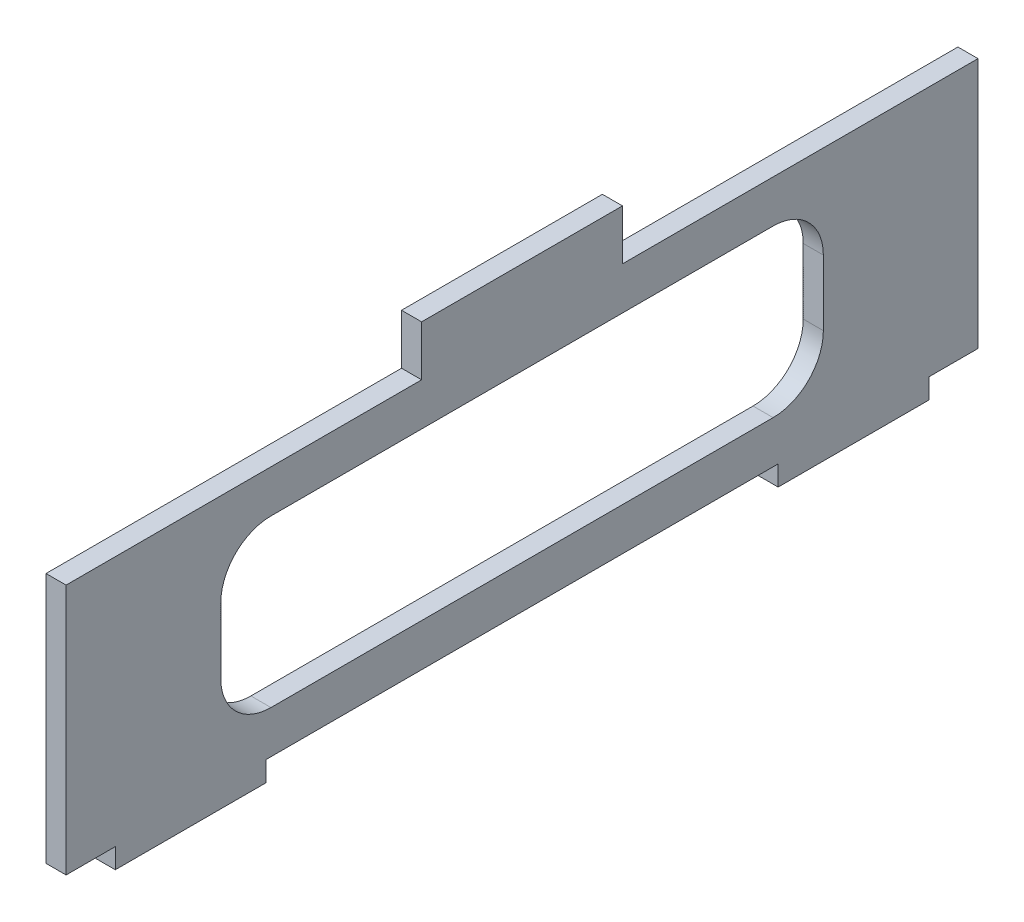
ISO-10303-21;
HEADER;
FILE_DESCRIPTION(('STEP AP214'),'2;1');
FILE_NAME('part.step','',(''),(''),'','','');
FILE_SCHEMA(('AUTOMOTIVE_DESIGN { 1 0 10303 214 1 1 1 1 }'));
ENDSEC;
DATA;
#1=APPLICATION_CONTEXT('core data for automotive mechanical design processes');
#2=APPLICATION_PROTOCOL_DEFINITION('international standard','automotive_design',2000,#1);
#3=PRODUCT_CONTEXT('',#1,'mechanical');
#4=PRODUCT('Part','Part','',(#3));
#5=PRODUCT_RELATED_PRODUCT_CATEGORY('part','',(#4));
#6=PRODUCT_DEFINITION_FORMATION('','',#4);
#7=PRODUCT_DEFINITION_CONTEXT('part definition',#1,'design');
#8=PRODUCT_DEFINITION('design','',#6,#7);
#9=PRODUCT_DEFINITION_SHAPE('','',#8);
#10=(LENGTH_UNIT() NAMED_UNIT(*) SI_UNIT(.MILLI.,.METRE.));
#11=(NAMED_UNIT(*) PLANE_ANGLE_UNIT() SI_UNIT($,.RADIAN.));
#12=(NAMED_UNIT(*) SI_UNIT($,.STERADIAN.) SOLID_ANGLE_UNIT());
#13=UNCERTAINTY_MEASURE_WITH_UNIT(LENGTH_MEASURE(1.E-05),#10,'distance_accuracy_value','');
#14=(GEOMETRIC_REPRESENTATION_CONTEXT(3) GLOBAL_UNCERTAINTY_ASSIGNED_CONTEXT((#13)) GLOBAL_UNIT_ASSIGNED_CONTEXT((#10,
#11,#12)) REPRESENTATION_CONTEXT('',''));
#15=CARTESIAN_POINT('',(0.,0.,0.));
#16=DIRECTION('',(0.,0.,1.));
#17=DIRECTION('',(1.,0.,0.));
#18=AXIS2_PLACEMENT_3D('',#15,#16,#17);
#19=CARTESIAN_POINT('',(4.,0.,0.));
#20=DIRECTION('',(1.,0.,0.));
#21=DIRECTION('',(0.,0.,-1.));
#22=AXIS2_PLACEMENT_3D('',#19,#20,#21);
#23=PLANE('',#22);
#24=DIRECTION('',(0.,0.,1.));
#25=VECTOR('',#24,1.);
#26=CARTESIAN_POINT('',(4.,25.,-20.));
#27=LINE('',#26,#25);
#28=CARTESIAN_POINT('',(4.,25.,-90.8));
#29=VERTEX_POINT('',#28);
#30=CARTESIAN_POINT('',(4.,25.,-20.));
#31=VERTEX_POINT('',#30);
#32=EDGE_CURVE('E264',#29,#31,#27,.T.);
#33=ORIENTED_EDGE('',*,*,#32,.T.);
#34=DIRECTION('',(0.,1.,0.));
#35=VECTOR('',#34,1.);
#36=CARTESIAN_POINT('',(4.,35.,-20.));
#37=LINE('',#36,#35);
#38=CARTESIAN_POINT('',(4.,35.,-20.));
#39=VERTEX_POINT('',#38);
#40=EDGE_CURVE('E268',#31,#39,#37,.T.);
#41=ORIENTED_EDGE('',*,*,#40,.T.);
#42=DIRECTION('',(0.,0.,1.));
#43=VECTOR('',#42,1.);
#44=CARTESIAN_POINT('',(4.,35.,20.));
#45=LINE('',#44,#43);
#46=CARTESIAN_POINT('',(4.,35.,20.));
#47=VERTEX_POINT('',#46);
#48=EDGE_CURVE('E271',#39,#47,#45,.T.);
#49=ORIENTED_EDGE('',*,*,#48,.T.);
#50=DIRECTION('',(0.,-1.,0.));
#51=VECTOR('',#50,1.);
#52=CARTESIAN_POINT('',(4.,25.,20.));
#53=LINE('',#52,#51);
#54=CARTESIAN_POINT('',(4.,25.,20.));
#55=VERTEX_POINT('',#54);
#56=EDGE_CURVE('E272',#47,#55,#53,.T.);
#57=ORIENTED_EDGE('',*,*,#56,.T.);
#58=DIRECTION('',(0.,0.,1.));
#59=VECTOR('',#58,1.);
#60=CARTESIAN_POINT('',(4.,25.,90.8));
#61=LINE('',#60,#59);
#62=CARTESIAN_POINT('',(4.,25.,90.8));
#63=VERTEX_POINT('',#62);
#64=EDGE_CURVE('E274',#55,#63,#61,.T.);
#65=ORIENTED_EDGE('',*,*,#64,.T.);
#66=DIRECTION('',(0.,-1.,0.));
#67=VECTOR('',#66,1.);
#68=CARTESIAN_POINT('',(4.,-25.,90.8));
#69=LINE('',#68,#67);
#70=CARTESIAN_POINT('',(4.,-25.,90.8));
#71=VERTEX_POINT('',#70);
#72=EDGE_CURVE('E280',#63,#71,#69,.T.);
#73=ORIENTED_EDGE('',*,*,#72,.T.);
#74=DIRECTION('',(0.,0.,-1.));
#75=VECTOR('',#74,1.);
#76=CARTESIAN_POINT('',(4.,-25.,90.8));
#77=LINE('',#76,#75);
#78=CARTESIAN_POINT('',(4.,-25.,81.));
#79=VERTEX_POINT('',#78);
#80=EDGE_CURVE('E276',#71,#79,#77,.T.);
#81=ORIENTED_EDGE('',*,*,#80,.T.);
#82=DIRECTION('',(0.,-1.,0.));
#83=VECTOR('',#82,1.);
#84=CARTESIAN_POINT('',(4.,-25.,81.));
#85=LINE('',#84,#83);
#86=CARTESIAN_POINT('',(4.,-29.,81.));
#87=VERTEX_POINT('',#86);
#88=EDGE_CURVE('E284',#79,#87,#85,.T.);
#89=ORIENTED_EDGE('',*,*,#88,.T.);
#90=DIRECTION('',(0.,0.,-1.));
#91=VECTOR('',#90,1.);
#92=CARTESIAN_POINT('',(4.,-29.,81.));
#93=LINE('',#92,#91);
#94=CARTESIAN_POINT('',(4.,-29.,51.));
#95=VERTEX_POINT('',#94);
#96=EDGE_CURVE('E285',#87,#95,#93,.T.);
#97=ORIENTED_EDGE('',*,*,#96,.T.);
#98=DIRECTION('',(0.,1.,0.));
#99=VECTOR('',#98,1.);
#100=CARTESIAN_POINT('',(4.,-29.,51.));
#101=LINE('',#100,#99);
#102=CARTESIAN_POINT('',(4.,-25.,51.));
#103=VERTEX_POINT('',#102);
#104=EDGE_CURVE('E282',#95,#103,#101,.T.);
#105=ORIENTED_EDGE('',*,*,#104,.T.);
#106=DIRECTION('',(0.,0.,-1.));
#107=VECTOR('',#106,1.);
#108=CARTESIAN_POINT('',(4.,-25.,51.));
#109=LINE('',#108,#107);
#110=CARTESIAN_POINT('',(4.,-25.,-51.));
#111=VERTEX_POINT('',#110);
#112=EDGE_CURVE('E290',#103,#111,#109,.T.);
#113=ORIENTED_EDGE('',*,*,#112,.T.);
#114=DIRECTION('',(0.,-1.,0.));
#115=VECTOR('',#114,1.);
#116=CARTESIAN_POINT('',(4.,-25.,-51.));
#117=LINE('',#116,#115);
#118=CARTESIAN_POINT('',(4.,-29.,-51.));
#119=VERTEX_POINT('',#118);
#120=EDGE_CURVE('E289',#111,#119,#117,.T.);
#121=ORIENTED_EDGE('',*,*,#120,.T.);
#122=DIRECTION('',(0.,0.,-1.));
#123=VECTOR('',#122,1.);
#124=CARTESIAN_POINT('',(4.,-29.,-51.));
#125=LINE('',#124,#123);
#126=CARTESIAN_POINT('',(4.,-29.,-81.));
#127=VERTEX_POINT('',#126);
#128=EDGE_CURVE('E292',#119,#127,#125,.T.);
#129=ORIENTED_EDGE('',*,*,#128,.T.);
#130=DIRECTION('',(0.,1.,0.));
#131=VECTOR('',#130,1.);
#132=CARTESIAN_POINT('',(4.,-29.,-81.));
#133=LINE('',#132,#131);
#134=CARTESIAN_POINT('',(4.,-25.,-81.));
#135=VERTEX_POINT('',#134);
#136=EDGE_CURVE('E291',#127,#135,#133,.T.);
#137=ORIENTED_EDGE('',*,*,#136,.T.);
#138=DIRECTION('',(0.,0.,-1.));
#139=VECTOR('',#138,1.);
#140=CARTESIAN_POINT('',(4.,-25.,-81.));
#141=LINE('',#140,#139);
#142=CARTESIAN_POINT('',(4.,-25.,-90.8));
#143=VERTEX_POINT('',#142);
#144=EDGE_CURVE('E293',#135,#143,#141,.T.);
#145=ORIENTED_EDGE('',*,*,#144,.T.);
#146=DIRECTION('',(0.,1.,0.));
#147=VECTOR('',#146,1.);
#148=CARTESIAN_POINT('',(4.,-25.,-90.8));
#149=LINE('',#148,#147);
#150=EDGE_CURVE('E296',#143,#29,#149,.T.);
#151=ORIENTED_EDGE('',*,*,#150,.T.);
#152=EDGE_LOOP('',(#33,#41,#49,#57,#65,#73,#81,#89,#97,#105,#113,#121,#129,#137,#145,#151));
#153=FACE_BOUND('',#152,.T.);
#154=DIRECTION('',(0.,0.,1.));
#155=VECTOR('',#154,1.);
#156=CARTESIAN_POINT('',(4.,16.5198237885463,50.));
#157=LINE('',#156,#155);
#158=CARTESIAN_POINT('',(4.,16.5198237885463,-50.));
#159=VERTEX_POINT('',#158);
#160=CARTESIAN_POINT('',(4.,16.5198237885463,50.));
#161=VERTEX_POINT('',#160);
#162=EDGE_CURVE('E208',#159,#161,#157,.T.);
#163=ORIENTED_EDGE('',*,*,#162,.F.);
#164=CARTESIAN_POINT('',(4.,6.51982378854626,-50.));
#165=DIRECTION('',(1.,0.,0.));
#166=DIRECTION('',(0.,0.,1.));
#167=AXIS2_PLACEMENT_3D('',#164,#165,#166);
#168=CIRCLE('',#167,10.);
#169=CARTESIAN_POINT('',(4.,6.51982378854626,-60.));
#170=VERTEX_POINT('',#169);
#171=EDGE_CURVE('E199',#170,#159,#168,.T.);
#172=ORIENTED_EDGE('',*,*,#171,.F.);
#173=DIRECTION('',(0.,1.,0.));
#174=VECTOR('',#173,1.);
#175=CARTESIAN_POINT('',(4.,6.51982378854626,-60.));
#176=LINE('',#175,#174);
#177=CARTESIAN_POINT('',(4.,-6.51982378854626,-60.));
#178=VERTEX_POINT('',#177);
#179=EDGE_CURVE('E231',#178,#170,#176,.T.);
#180=ORIENTED_EDGE('',*,*,#179,.F.);
#181=CARTESIAN_POINT('',(4.,-6.51982378854626,-50.));
#182=DIRECTION('',(1.,0.,0.));
#183=DIRECTION('',(0.,0.,1.));
#184=AXIS2_PLACEMENT_3D('',#181,#182,#183);
#185=CIRCLE('',#184,10.);
#186=CARTESIAN_POINT('',(4.,-16.5198237885463,-50.));
#187=VERTEX_POINT('',#186);
#188=EDGE_CURVE('E233',#187,#178,#185,.T.);
#189=ORIENTED_EDGE('',*,*,#188,.F.);
#190=DIRECTION('',(0.,0.,-1.));
#191=VECTOR('',#190,1.);
#192=CARTESIAN_POINT('',(4.,-16.5198237885463,50.));
#193=LINE('',#192,#191);
#194=CARTESIAN_POINT('',(4.,-16.5198237885463,50.));
#195=VERTEX_POINT('',#194);
#196=EDGE_CURVE('E228',#195,#187,#193,.T.);
#197=ORIENTED_EDGE('',*,*,#196,.F.);
#198=CARTESIAN_POINT('',(4.,-6.51982378854626,50.));
#199=DIRECTION('',(1.,0.,0.));
#200=DIRECTION('',(0.,0.,-1.));
#201=AXIS2_PLACEMENT_3D('',#198,#199,#200);
#202=CIRCLE('',#201,10.);
#203=CARTESIAN_POINT('',(4.,-6.51982378854626,60.));
#204=VERTEX_POINT('',#203);
#205=EDGE_CURVE('E226',#204,#195,#202,.T.);
#206=ORIENTED_EDGE('',*,*,#205,.F.);
#207=DIRECTION('',(0.,-1.,0.));
#208=VECTOR('',#207,1.);
#209=CARTESIAN_POINT('',(4.,6.51982378854626,60.));
#210=LINE('',#209,#208);
#211=CARTESIAN_POINT('',(4.,6.51982378854626,60.));
#212=VERTEX_POINT('',#211);
#213=EDGE_CURVE('E224',#212,#204,#210,.T.);
#214=ORIENTED_EDGE('',*,*,#213,.F.);
#215=CARTESIAN_POINT('',(4.,6.51982378854626,50.));
#216=DIRECTION('',(1.,0.,0.));
#217=DIRECTION('',(0.,0.,-1.));
#218=AXIS2_PLACEMENT_3D('',#215,#216,#217);
#219=CIRCLE('',#218,10.);
#220=EDGE_CURVE('E222',#161,#212,#219,.T.);
#221=ORIENTED_EDGE('',*,*,#220,.F.);
#222=EDGE_LOOP('',(#163,#172,#180,#189,#197,#206,#214,#221));
#223=FACE_BOUND('',#222,.T.);
#224=ADVANCED_FACE('F39',(#153,#223),#23,.T.);
#225=CARTESIAN_POINT('',(0.,0.,0.));
#226=DIRECTION('',(1.,0.,0.));
#227=DIRECTION('',(0.,0.,-1.));
#228=AXIS2_PLACEMENT_3D('',#225,#226,#227);
#229=PLANE('',#228);
#230=DIRECTION('',(0.,0.,1.));
#231=VECTOR('',#230,1.);
#232=CARTESIAN_POINT('',(0.,25.,-20.));
#233=LINE('',#232,#231);
#234=CARTESIAN_POINT('',(0.,25.,-90.8));
#235=VERTEX_POINT('',#234);
#236=CARTESIAN_POINT('',(0.,25.,-20.));
#237=VERTEX_POINT('',#236);
#238=EDGE_CURVE('E216',#235,#237,#233,.T.);
#239=ORIENTED_EDGE('',*,*,#238,.F.);
#240=DIRECTION('',(0.,1.,0.));
#241=VECTOR('',#240,1.);
#242=CARTESIAN_POINT('',(0.,-25.,-90.8));
#243=LINE('',#242,#241);
#244=CARTESIAN_POINT('',(0.,-25.,-90.8));
#245=VERTEX_POINT('',#244);
#246=EDGE_CURVE('E267',#245,#235,#243,.T.);
#247=ORIENTED_EDGE('',*,*,#246,.F.);
#248=DIRECTION('',(0.,0.,-1.));
#249=VECTOR('',#248,1.);
#250=CARTESIAN_POINT('',(0.,-25.,-81.));
#251=LINE('',#250,#249);
#252=CARTESIAN_POINT('',(0.,-25.,-81.));
#253=VERTEX_POINT('',#252);
#254=EDGE_CURVE('E327',#253,#245,#251,.T.);
#255=ORIENTED_EDGE('',*,*,#254,.F.);
#256=DIRECTION('',(0.,1.,0.));
#257=VECTOR('',#256,1.);
#258=CARTESIAN_POINT('',(0.,-29.,-81.));
#259=LINE('',#258,#257);
#260=CARTESIAN_POINT('',(0.,-29.,-81.));
#261=VERTEX_POINT('',#260);
#262=EDGE_CURVE('E326',#261,#253,#259,.T.);
#263=ORIENTED_EDGE('',*,*,#262,.F.);
#264=DIRECTION('',(0.,0.,-1.));
#265=VECTOR('',#264,1.);
#266=CARTESIAN_POINT('',(0.,-29.,-51.));
#267=LINE('',#266,#265);
#268=CARTESIAN_POINT('',(0.,-29.,-51.));
#269=VERTEX_POINT('',#268);
#270=EDGE_CURVE('E322',#269,#261,#267,.T.);
#271=ORIENTED_EDGE('',*,*,#270,.F.);
#272=DIRECTION('',(0.,-1.,0.));
#273=VECTOR('',#272,1.);
#274=CARTESIAN_POINT('',(0.,-25.,-51.));
#275=LINE('',#274,#273);
#276=CARTESIAN_POINT('',(0.,-25.,-51.));
#277=VERTEX_POINT('',#276);
#278=EDGE_CURVE('E325',#277,#269,#275,.T.);
#279=ORIENTED_EDGE('',*,*,#278,.F.);
#280=DIRECTION('',(0.,0.,-1.));
#281=VECTOR('',#280,1.);
#282=CARTESIAN_POINT('',(0.,-25.,51.));
#283=LINE('',#282,#281);
#284=CARTESIAN_POINT('',(0.,-25.,51.));
#285=VERTEX_POINT('',#284);
#286=EDGE_CURVE('E319',#285,#277,#283,.T.);
#287=ORIENTED_EDGE('',*,*,#286,.F.);
#288=DIRECTION('',(0.,1.,0.));
#289=VECTOR('',#288,1.);
#290=CARTESIAN_POINT('',(0.,-29.,51.));
#291=LINE('',#290,#289);
#292=CARTESIAN_POINT('',(0.,-29.,51.));
#293=VERTEX_POINT('',#292);
#294=EDGE_CURVE('E318',#293,#285,#291,.T.);
#295=ORIENTED_EDGE('',*,*,#294,.F.);
#296=DIRECTION('',(0.,0.,-1.));
#297=VECTOR('',#296,1.);
#298=CARTESIAN_POINT('',(0.,-29.,81.));
#299=LINE('',#298,#297);
#300=CARTESIAN_POINT('',(0.,-29.,81.));
#301=VERTEX_POINT('',#300);
#302=EDGE_CURVE('E316',#301,#293,#299,.T.);
#303=ORIENTED_EDGE('',*,*,#302,.F.);
#304=DIRECTION('',(0.,-1.,0.));
#305=VECTOR('',#304,1.);
#306=CARTESIAN_POINT('',(0.,-25.,81.));
#307=LINE('',#306,#305);
#308=CARTESIAN_POINT('',(0.,-25.,81.));
#309=VERTEX_POINT('',#308);
#310=EDGE_CURVE('E314',#309,#301,#307,.T.);
#311=ORIENTED_EDGE('',*,*,#310,.F.);
#312=DIRECTION('',(0.,0.,-1.));
#313=VECTOR('',#312,1.);
#314=CARTESIAN_POINT('',(0.,-25.,90.8));
#315=LINE('',#314,#313);
#316=CARTESIAN_POINT('',(0.,-25.,90.8));
#317=VERTEX_POINT('',#316);
#318=EDGE_CURVE('E315',#317,#309,#315,.T.);
#319=ORIENTED_EDGE('',*,*,#318,.F.);
#320=DIRECTION('',(0.,-1.,0.));
#321=VECTOR('',#320,1.);
#322=CARTESIAN_POINT('',(0.,-25.,90.8));
#323=LINE('',#322,#321);
#324=CARTESIAN_POINT('',(0.,25.,90.8));
#325=VERTEX_POINT('',#324);
#326=EDGE_CURVE('E309',#325,#317,#323,.T.);
#327=ORIENTED_EDGE('',*,*,#326,.F.);
#328=DIRECTION('',(0.,0.,1.));
#329=VECTOR('',#328,1.);
#330=CARTESIAN_POINT('',(0.,25.,90.8));
#331=LINE('',#330,#329);
#332=CARTESIAN_POINT('',(0.,25.,20.));
#333=VERTEX_POINT('',#332);
#334=EDGE_CURVE('E306',#333,#325,#331,.T.);
#335=ORIENTED_EDGE('',*,*,#334,.F.);
#336=DIRECTION('',(0.,-1.,0.));
#337=VECTOR('',#336,1.);
#338=CARTESIAN_POINT('',(0.,25.,20.));
#339=LINE('',#338,#337);
#340=CARTESIAN_POINT('',(0.,35.,20.));
#341=VERTEX_POINT('',#340);
#342=EDGE_CURVE('E308',#341,#333,#339,.T.);
#343=ORIENTED_EDGE('',*,*,#342,.F.);
#344=DIRECTION('',(0.,0.,1.));
#345=VECTOR('',#344,1.);
#346=CARTESIAN_POINT('',(0.,35.,20.));
#347=LINE('',#346,#345);
#348=CARTESIAN_POINT('',(0.,35.,-20.));
#349=VERTEX_POINT('',#348);
#350=EDGE_CURVE('E304',#349,#341,#347,.T.);
#351=ORIENTED_EDGE('',*,*,#350,.F.);
#352=DIRECTION('',(0.,1.,0.));
#353=VECTOR('',#352,1.);
#354=CARTESIAN_POINT('',(0.,35.,-20.));
#355=LINE('',#354,#353);
#356=EDGE_CURVE('E305',#237,#349,#355,.T.);
#357=ORIENTED_EDGE('',*,*,#356,.F.);
#358=EDGE_LOOP('',(#239,#247,#255,#263,#271,#279,#287,#295,#303,#311,#319,#327,#335,#343,#351,#357));
#359=FACE_BOUND('',#358,.T.);
#360=CARTESIAN_POINT('',(0.,6.51982378854626,-50.));
#361=DIRECTION('',(1.,0.,0.));
#362=DIRECTION('',(0.,0.,1.));
#363=AXIS2_PLACEMENT_3D('',#360,#361,#362);
#364=CIRCLE('',#363,10.);
#365=CARTESIAN_POINT('',(0.,6.51982378854626,-60.));
#366=VERTEX_POINT('',#365);
#367=CARTESIAN_POINT('',(0.,16.5198237885463,-50.));
#368=VERTEX_POINT('',#367);
#369=EDGE_CURVE('E61',#366,#368,#364,.T.);
#370=ORIENTED_EDGE('',*,*,#369,.T.);
#371=DIRECTION('',(0.,0.,1.));
#372=VECTOR('',#371,1.);
#373=CARTESIAN_POINT('',(0.,16.5198237885463,50.));
#374=LINE('',#373,#372);
#375=CARTESIAN_POINT('',(0.,16.5198237885463,50.));
#376=VERTEX_POINT('',#375);
#377=EDGE_CURVE('E214',#368,#376,#374,.T.);
#378=ORIENTED_EDGE('',*,*,#377,.T.);
#379=CARTESIAN_POINT('',(0.,6.51982378854626,50.));
#380=DIRECTION('',(1.,0.,0.));
#381=DIRECTION('',(0.,0.,-1.));
#382=AXIS2_PLACEMENT_3D('',#379,#380,#381);
#383=CIRCLE('',#382,10.);
#384=CARTESIAN_POINT('',(0.,6.51982378854626,60.));
#385=VERTEX_POINT('',#384);
#386=EDGE_CURVE('E240',#376,#385,#383,.T.);
#387=ORIENTED_EDGE('',*,*,#386,.T.);
#388=DIRECTION('',(0.,-1.,0.));
#389=VECTOR('',#388,1.);
#390=CARTESIAN_POINT('',(0.,6.51982378854626,60.));
#391=LINE('',#390,#389);
#392=CARTESIAN_POINT('',(0.,-6.51982378854626,60.));
#393=VERTEX_POINT('',#392);
#394=EDGE_CURVE('E238',#385,#393,#391,.T.);
#395=ORIENTED_EDGE('',*,*,#394,.T.);
#396=CARTESIAN_POINT('',(0.,-6.51982378854626,50.));
#397=DIRECTION('',(1.,0.,0.));
#398=DIRECTION('',(0.,0.,-1.));
#399=AXIS2_PLACEMENT_3D('',#396,#397,#398);
#400=CIRCLE('',#399,10.);
#401=CARTESIAN_POINT('',(0.,-16.5198237885463,50.));
#402=VERTEX_POINT('',#401);
#403=EDGE_CURVE('E245',#393,#402,#400,.T.);
#404=ORIENTED_EDGE('',*,*,#403,.T.);
#405=DIRECTION('',(0.,0.,-1.));
#406=VECTOR('',#405,1.);
#407=CARTESIAN_POINT('',(0.,-16.5198237885463,50.));
#408=LINE('',#407,#406);
#409=CARTESIAN_POINT('',(0.,-16.5198237885463,-50.));
#410=VERTEX_POINT('',#409);
#411=EDGE_CURVE('E248',#402,#410,#408,.T.);
#412=ORIENTED_EDGE('',*,*,#411,.T.);
#413=CARTESIAN_POINT('',(0.,-6.51982378854626,-50.));
#414=DIRECTION('',(1.,0.,0.));
#415=DIRECTION('',(0.,0.,1.));
#416=AXIS2_PLACEMENT_3D('',#413,#414,#415);
#417=CIRCLE('',#416,10.);
#418=CARTESIAN_POINT('',(0.,-6.51982378854626,-60.));
#419=VERTEX_POINT('',#418);
#420=EDGE_CURVE('E249',#410,#419,#417,.T.);
#421=ORIENTED_EDGE('',*,*,#420,.T.);
#422=DIRECTION('',(0.,1.,0.));
#423=VECTOR('',#422,1.);
#424=CARTESIAN_POINT('',(0.,6.51982378854626,-60.));
#425=LINE('',#424,#423);
#426=EDGE_CURVE('E207',#419,#366,#425,.T.);
#427=ORIENTED_EDGE('',*,*,#426,.T.);
#428=EDGE_LOOP('',(#370,#378,#387,#395,#404,#412,#421,#427));
#429=FACE_BOUND('',#428,.T.);
#430=ADVANCED_FACE('F385',(#359,#429),#229,.F.);
#431=CARTESIAN_POINT('',(4.,25.,-20.));
#432=DIRECTION('',(0.,-1.,0.));
#433=DIRECTION('',(0.,0.,-1.));
#434=AXIS2_PLACEMENT_3D('',#431,#432,#433);
#435=PLANE('',#434);
#436=ORIENTED_EDGE('',*,*,#238,.T.);
#437=DIRECTION('',(-1.,0.,0.));
#438=VECTOR('',#437,1.);
#439=CARTESIAN_POINT('',(4.,25.,-20.));
#440=LINE('',#439,#438);
#441=EDGE_CURVE('E11',#31,#237,#440,.T.);
#442=ORIENTED_EDGE('',*,*,#441,.F.);
#443=ORIENTED_EDGE('',*,*,#32,.F.);
#444=DIRECTION('',(-1.,0.,0.));
#445=VECTOR('',#444,1.);
#446=CARTESIAN_POINT('',(4.,25.,-90.8));
#447=LINE('',#446,#445);
#448=EDGE_CURVE('E298',#29,#235,#447,.T.);
#449=ORIENTED_EDGE('',*,*,#448,.T.);
#450=EDGE_LOOP('',(#436,#442,#443,#449));
#451=FACE_BOUND('',#450,.T.);
#452=ADVANCED_FACE('F41',(#451),#435,.F.);
#453=CARTESIAN_POINT('',(4.,35.,-20.));
#454=DIRECTION('',(0.,0.,1.));
#455=DIRECTION('',(1.,0.,0.));
#456=AXIS2_PLACEMENT_3D('',#453,#454,#455);
#457=PLANE('',#456);
#458=ORIENTED_EDGE('',*,*,#356,.T.);
#459=DIRECTION('',(-1.,0.,0.));
#460=VECTOR('',#459,1.);
#461=CARTESIAN_POINT('',(4.,35.,-20.));
#462=LINE('',#461,#460);
#463=EDGE_CURVE('E50',#39,#349,#462,.T.);
#464=ORIENTED_EDGE('',*,*,#463,.F.);
#465=ORIENTED_EDGE('',*,*,#40,.F.);
#466=ORIENTED_EDGE('',*,*,#441,.T.);
#467=EDGE_LOOP('',(#458,#464,#465,#466));
#468=FACE_BOUND('',#467,.T.);
#469=ADVANCED_FACE('F399',(#468),#457,.F.);
#470=CARTESIAN_POINT('',(4.,35.,20.));
#471=DIRECTION('',(0.,-1.,0.));
#472=DIRECTION('',(0.,0.,-1.));
#473=AXIS2_PLACEMENT_3D('',#470,#471,#472);
#474=PLANE('',#473);
#475=ORIENTED_EDGE('',*,*,#350,.T.);
#476=DIRECTION('',(-1.,0.,0.));
#477=VECTOR('',#476,1.);
#478=CARTESIAN_POINT('',(4.,35.,20.));
#479=LINE('',#478,#477);
#480=EDGE_CURVE('E369',#47,#341,#479,.T.);
#481=ORIENTED_EDGE('',*,*,#480,.F.);
#482=ORIENTED_EDGE('',*,*,#48,.F.);
#483=ORIENTED_EDGE('',*,*,#463,.T.);
#484=EDGE_LOOP('',(#475,#481,#482,#483));
#485=FACE_BOUND('',#484,.T.);
#486=ADVANCED_FACE('F376',(#485),#474,.F.);
#487=CARTESIAN_POINT('',(4.,25.,20.));
#488=DIRECTION('',(0.,0.,-1.));
#489=DIRECTION('',(-1.,0.,0.));
#490=AXIS2_PLACEMENT_3D('',#487,#488,#489);
#491=PLANE('',#490);
#492=ORIENTED_EDGE('',*,*,#342,.T.);
#493=DIRECTION('',(-1.,0.,0.));
#494=VECTOR('',#493,1.);
#495=CARTESIAN_POINT('',(4.,25.,20.));
#496=LINE('',#495,#494);
#497=EDGE_CURVE('E368',#55,#333,#496,.T.);
#498=ORIENTED_EDGE('',*,*,#497,.F.);
#499=ORIENTED_EDGE('',*,*,#56,.F.);
#500=ORIENTED_EDGE('',*,*,#480,.T.);
#501=EDGE_LOOP('',(#492,#498,#499,#500));
#502=FACE_BOUND('',#501,.T.);
#503=ADVANCED_FACE('F389',(#502),#491,.F.);
#504=CARTESIAN_POINT('',(4.,25.,90.8));
#505=DIRECTION('',(0.,-1.,0.));
#506=DIRECTION('',(0.,0.,-1.));
#507=AXIS2_PLACEMENT_3D('',#504,#505,#506);
#508=PLANE('',#507);
#509=ORIENTED_EDGE('',*,*,#334,.T.);
#510=DIRECTION('',(-1.,0.,0.));
#511=VECTOR('',#510,1.);
#512=CARTESIAN_POINT('',(4.,25.,90.8));
#513=LINE('',#512,#511);
#514=EDGE_CURVE('E361',#63,#325,#513,.T.);
#515=ORIENTED_EDGE('',*,*,#514,.F.);
#516=ORIENTED_EDGE('',*,*,#64,.F.);
#517=ORIENTED_EDGE('',*,*,#497,.T.);
#518=EDGE_LOOP('',(#509,#515,#516,#517));
#519=FACE_BOUND('',#518,.T.);
#520=ADVANCED_FACE('F391',(#519),#508,.F.);
#521=CARTESIAN_POINT('',(4.,-25.,90.8));
#522=DIRECTION('',(0.,0.,-1.));
#523=DIRECTION('',(-1.,0.,0.));
#524=AXIS2_PLACEMENT_3D('',#521,#522,#523);
#525=PLANE('',#524);
#526=ORIENTED_EDGE('',*,*,#326,.T.);
#527=DIRECTION('',(-1.,0.,0.));
#528=VECTOR('',#527,1.);
#529=CARTESIAN_POINT('',(4.,-25.,90.8));
#530=LINE('',#529,#528);
#531=EDGE_CURVE('E357',#71,#317,#530,.T.);
#532=ORIENTED_EDGE('',*,*,#531,.F.);
#533=ORIENTED_EDGE('',*,*,#72,.F.);
#534=ORIENTED_EDGE('',*,*,#514,.T.);
#535=EDGE_LOOP('',(#526,#532,#533,#534));
#536=FACE_BOUND('',#535,.T.);
#537=ADVANCED_FACE('F455',(#536),#525,.F.);
#538=CARTESIAN_POINT('',(4.,-25.,90.8));
#539=DIRECTION('',(0.,1.,0.));
#540=DIRECTION('',(0.,0.,1.));
#541=AXIS2_PLACEMENT_3D('',#538,#539,#540);
#542=PLANE('',#541);
#543=ORIENTED_EDGE('',*,*,#318,.T.);
#544=DIRECTION('',(-1.,0.,0.));
#545=VECTOR('',#544,1.);
#546=CARTESIAN_POINT('',(4.,-25.,81.));
#547=LINE('',#546,#545);
#548=EDGE_CURVE('E360',#79,#309,#547,.T.);
#549=ORIENTED_EDGE('',*,*,#548,.F.);
#550=ORIENTED_EDGE('',*,*,#80,.F.);
#551=ORIENTED_EDGE('',*,*,#531,.T.);
#552=EDGE_LOOP('',(#543,#549,#550,#551));
#553=FACE_BOUND('',#552,.T.);
#554=ADVANCED_FACE('F448',(#553),#542,.F.);
#555=CARTESIAN_POINT('',(4.,-25.,81.));
#556=DIRECTION('',(0.,0.,-1.));
#557=DIRECTION('',(-1.,0.,0.));
#558=AXIS2_PLACEMENT_3D('',#555,#556,#557);
#559=PLANE('',#558);
#560=ORIENTED_EDGE('',*,*,#310,.T.);
#561=DIRECTION('',(-1.,0.,0.));
#562=VECTOR('',#561,1.);
#563=CARTESIAN_POINT('',(4.,-29.,81.));
#564=LINE('',#563,#562);
#565=EDGE_CURVE('E353',#87,#301,#564,.T.);
#566=ORIENTED_EDGE('',*,*,#565,.F.);
#567=ORIENTED_EDGE('',*,*,#88,.F.);
#568=ORIENTED_EDGE('',*,*,#548,.T.);
#569=EDGE_LOOP('',(#560,#566,#567,#568));
#570=FACE_BOUND('',#569,.T.);
#571=ADVANCED_FACE('F443',(#570),#559,.F.);
#572=CARTESIAN_POINT('',(4.,-29.,81.));
#573=DIRECTION('',(0.,1.,0.));
#574=DIRECTION('',(0.,0.,1.));
#575=AXIS2_PLACEMENT_3D('',#572,#573,#574);
#576=PLANE('',#575);
#577=ORIENTED_EDGE('',*,*,#302,.T.);
#578=DIRECTION('',(-1.,0.,0.));
#579=VECTOR('',#578,1.);
#580=CARTESIAN_POINT('',(4.,-29.,51.));
#581=LINE('',#580,#579);
#582=EDGE_CURVE('E354',#95,#293,#581,.T.);
#583=ORIENTED_EDGE('',*,*,#582,.F.);
#584=ORIENTED_EDGE('',*,*,#96,.F.);
#585=ORIENTED_EDGE('',*,*,#565,.T.);
#586=EDGE_LOOP('',(#577,#583,#584,#585));
#587=FACE_BOUND('',#586,.T.);
#588=ADVANCED_FACE('F442',(#587),#576,.F.);
#589=CARTESIAN_POINT('',(4.,-29.,51.));
#590=DIRECTION('',(0.,0.,1.));
#591=DIRECTION('',(1.,0.,0.));
#592=AXIS2_PLACEMENT_3D('',#589,#590,#591);
#593=PLANE('',#592);
#594=ORIENTED_EDGE('',*,*,#294,.T.);
#595=DIRECTION('',(-1.,0.,0.));
#596=VECTOR('',#595,1.);
#597=CARTESIAN_POINT('',(4.,-25.,51.));
#598=LINE('',#597,#596);
#599=EDGE_CURVE('E346',#103,#285,#598,.T.);
#600=ORIENTED_EDGE('',*,*,#599,.F.);
#601=ORIENTED_EDGE('',*,*,#104,.F.);
#602=ORIENTED_EDGE('',*,*,#582,.T.);
#603=EDGE_LOOP('',(#594,#600,#601,#602));
#604=FACE_BOUND('',#603,.T.);
#605=ADVANCED_FACE('F436',(#604),#593,.F.);
#606=CARTESIAN_POINT('',(4.,-25.,51.));
#607=DIRECTION('',(0.,1.,0.));
#608=DIRECTION('',(0.,0.,1.));
#609=AXIS2_PLACEMENT_3D('',#606,#607,#608);
#610=PLANE('',#609);
#611=ORIENTED_EDGE('',*,*,#286,.T.);
#612=DIRECTION('',(-1.,0.,0.));
#613=VECTOR('',#612,1.);
#614=CARTESIAN_POINT('',(4.,-25.,-51.));
#615=LINE('',#614,#613);
#616=EDGE_CURVE('E342',#111,#277,#615,.T.);
#617=ORIENTED_EDGE('',*,*,#616,.F.);
#618=ORIENTED_EDGE('',*,*,#112,.F.);
#619=ORIENTED_EDGE('',*,*,#599,.T.);
#620=EDGE_LOOP('',(#611,#617,#618,#619));
#621=FACE_BOUND('',#620,.T.);
#622=ADVANCED_FACE('F429',(#621),#610,.F.);
#623=CARTESIAN_POINT('',(4.,-25.,-51.));
#624=DIRECTION('',(0.,0.,-1.));
#625=DIRECTION('',(-1.,0.,0.));
#626=AXIS2_PLACEMENT_3D('',#623,#624,#625);
#627=PLANE('',#626);
#628=ORIENTED_EDGE('',*,*,#278,.T.);
#629=DIRECTION('',(-1.,0.,0.));
#630=VECTOR('',#629,1.);
#631=CARTESIAN_POINT('',(4.,-29.,-51.));
#632=LINE('',#631,#630);
#633=EDGE_CURVE('E345',#119,#269,#632,.T.);
#634=ORIENTED_EDGE('',*,*,#633,.F.);
#635=ORIENTED_EDGE('',*,*,#120,.F.);
#636=ORIENTED_EDGE('',*,*,#616,.T.);
#637=EDGE_LOOP('',(#628,#634,#635,#636));
#638=FACE_BOUND('',#637,.T.);
#639=ADVANCED_FACE('F426',(#638),#627,.F.);
#640=CARTESIAN_POINT('',(4.,-29.,-51.));
#641=DIRECTION('',(0.,1.,0.));
#642=DIRECTION('',(0.,0.,1.));
#643=AXIS2_PLACEMENT_3D('',#640,#641,#642);
#644=PLANE('',#643);
#645=ORIENTED_EDGE('',*,*,#270,.T.);
#646=DIRECTION('',(-1.,0.,0.));
#647=VECTOR('',#646,1.);
#648=CARTESIAN_POINT('',(4.,-29.,-81.));
#649=LINE('',#648,#647);
#650=EDGE_CURVE('E338',#127,#261,#649,.T.);
#651=ORIENTED_EDGE('',*,*,#650,.F.);
#652=ORIENTED_EDGE('',*,*,#128,.F.);
#653=ORIENTED_EDGE('',*,*,#633,.T.);
#654=EDGE_LOOP('',(#645,#651,#652,#653));
#655=FACE_BOUND('',#654,.T.);
#656=ADVANCED_FACE('F423',(#655),#644,.F.);
#657=CARTESIAN_POINT('',(4.,-29.,-81.));
#658=DIRECTION('',(0.,0.,1.));
#659=DIRECTION('',(1.,0.,0.));
#660=AXIS2_PLACEMENT_3D('',#657,#658,#659);
#661=PLANE('',#660);
#662=ORIENTED_EDGE('',*,*,#262,.T.);
#663=DIRECTION('',(-1.,0.,0.));
#664=VECTOR('',#663,1.);
#665=CARTESIAN_POINT('',(4.,-25.,-81.));
#666=LINE('',#665,#664);
#667=EDGE_CURVE('E339',#135,#253,#666,.T.);
#668=ORIENTED_EDGE('',*,*,#667,.F.);
#669=ORIENTED_EDGE('',*,*,#136,.F.);
#670=ORIENTED_EDGE('',*,*,#650,.T.);
#671=EDGE_LOOP('',(#662,#668,#669,#670));
#672=FACE_BOUND('',#671,.T.);
#673=ADVANCED_FACE('F412',(#672),#661,.F.);
#674=CARTESIAN_POINT('',(4.,-25.,-81.));
#675=DIRECTION('',(0.,1.,0.));
#676=DIRECTION('',(0.,0.,1.));
#677=AXIS2_PLACEMENT_3D('',#674,#675,#676);
#678=PLANE('',#677);
#679=ORIENTED_EDGE('',*,*,#254,.T.);
#680=DIRECTION('',(-1.,0.,0.));
#681=VECTOR('',#680,1.);
#682=CARTESIAN_POINT('',(4.,-25.,-90.8));
#683=LINE('',#682,#681);
#684=EDGE_CURVE('E334',#143,#245,#683,.T.);
#685=ORIENTED_EDGE('',*,*,#684,.F.);
#686=ORIENTED_EDGE('',*,*,#144,.F.);
#687=ORIENTED_EDGE('',*,*,#667,.T.);
#688=EDGE_LOOP('',(#679,#685,#686,#687));
#689=FACE_BOUND('',#688,.T.);
#690=ADVANCED_FACE('F413',(#689),#678,.F.);
#691=CARTESIAN_POINT('',(4.,-25.,-90.8));
#692=DIRECTION('',(0.,0.,1.));
#693=DIRECTION('',(1.,0.,0.));
#694=AXIS2_PLACEMENT_3D('',#691,#692,#693);
#695=PLANE('',#694);
#696=ORIENTED_EDGE('',*,*,#246,.T.);
#697=ORIENTED_EDGE('',*,*,#448,.F.);
#698=ORIENTED_EDGE('',*,*,#150,.F.);
#699=ORIENTED_EDGE('',*,*,#684,.T.);
#700=EDGE_LOOP('',(#696,#697,#698,#699));
#701=FACE_BOUND('',#700,.T.);
#702=ADVANCED_FACE('F409',(#701),#695,.F.);
#703=CARTESIAN_POINT('',(4.,6.51982378854626,-50.));
#704=DIRECTION('',(-1.,0.,0.));
#705=DIRECTION('',(0.,0.,1.));
#706=AXIS2_PLACEMENT_3D('',#703,#704,#705);
#707=CYLINDRICAL_SURFACE('',#706,10.);
#708=ORIENTED_EDGE('',*,*,#369,.F.);
#709=DIRECTION('',(-1.,0.,0.));
#710=VECTOR('',#709,1.);
#711=CARTESIAN_POINT('',(4.,6.51982378854626,-60.));
#712=LINE('',#711,#710);
#713=EDGE_CURVE('E204',#170,#366,#712,.T.);
#714=ORIENTED_EDGE('',*,*,#713,.F.);
#715=ORIENTED_EDGE('',*,*,#171,.T.);
#716=DIRECTION('',(-1.,0.,0.));
#717=VECTOR('',#716,1.);
#718=CARTESIAN_POINT('',(4.,16.5198237885463,-50.));
#719=LINE('',#718,#717);
#720=EDGE_CURVE('E201',#159,#368,#719,.T.);
#721=ORIENTED_EDGE('',*,*,#720,.T.);
#722=EDGE_LOOP('',(#708,#714,#715,#721));
#723=FACE_BOUND('',#722,.T.);
#724=ADVANCED_FACE('F205',(#723),#707,.F.);
#725=CARTESIAN_POINT('',(4.,16.5198237885463,50.));
#726=DIRECTION('',(0.,-1.,0.));
#727=DIRECTION('',(0.,0.,-1.));
#728=AXIS2_PLACEMENT_3D('',#725,#726,#727);
#729=PLANE('',#728);
#730=ORIENTED_EDGE('',*,*,#377,.F.);
#731=ORIENTED_EDGE('',*,*,#720,.F.);
#732=ORIENTED_EDGE('',*,*,#162,.T.);
#733=DIRECTION('',(-1.,0.,0.));
#734=VECTOR('',#733,1.);
#735=CARTESIAN_POINT('',(4.,16.5198237885463,50.));
#736=LINE('',#735,#734);
#737=EDGE_CURVE('E220',#161,#376,#736,.T.);
#738=ORIENTED_EDGE('',*,*,#737,.T.);
#739=EDGE_LOOP('',(#730,#731,#732,#738));
#740=FACE_BOUND('',#739,.T.);
#741=ADVANCED_FACE('F215',(#740),#729,.T.);
#742=CARTESIAN_POINT('',(4.,6.51982378854626,50.));
#743=DIRECTION('',(-1.,0.,0.));
#744=DIRECTION('',(0.,0.,1.));
#745=AXIS2_PLACEMENT_3D('',#742,#743,#744);
#746=CYLINDRICAL_SURFACE('',#745,10.);
#747=ORIENTED_EDGE('',*,*,#386,.F.);
#748=ORIENTED_EDGE('',*,*,#737,.F.);
#749=ORIENTED_EDGE('',*,*,#220,.T.);
#750=DIRECTION('',(-1.,0.,0.));
#751=VECTOR('',#750,1.);
#752=CARTESIAN_POINT('',(4.,6.51982378854626,60.));
#753=LINE('',#752,#751);
#754=EDGE_CURVE('E265',#212,#385,#753,.T.);
#755=ORIENTED_EDGE('',*,*,#754,.T.);
#756=EDGE_LOOP('',(#747,#748,#749,#755));
#757=FACE_BOUND('',#756,.T.);
#758=ADVANCED_FACE('F542',(#757),#746,.F.);
#759=CARTESIAN_POINT('',(4.,6.51982378854626,60.));
#760=DIRECTION('',(0.,0.,-1.));
#761=DIRECTION('',(-1.,0.,0.));
#762=AXIS2_PLACEMENT_3D('',#759,#760,#761);
#763=PLANE('',#762);
#764=ORIENTED_EDGE('',*,*,#394,.F.);
#765=ORIENTED_EDGE('',*,*,#754,.F.);
#766=ORIENTED_EDGE('',*,*,#213,.T.);
#767=DIRECTION('',(-1.,0.,0.));
#768=VECTOR('',#767,1.);
#769=CARTESIAN_POINT('',(4.,-6.51982378854626,60.));
#770=LINE('',#769,#768);
#771=EDGE_CURVE('E257',#204,#393,#770,.T.);
#772=ORIENTED_EDGE('',*,*,#771,.T.);
#773=EDGE_LOOP('',(#764,#765,#766,#772));
#774=FACE_BOUND('',#773,.T.);
#775=ADVANCED_FACE('F552',(#774),#763,.T.);
#776=CARTESIAN_POINT('',(4.,-6.51982378854626,50.));
#777=DIRECTION('',(-1.,0.,0.));
#778=DIRECTION('',(0.,0.,1.));
#779=AXIS2_PLACEMENT_3D('',#776,#777,#778);
#780=CYLINDRICAL_SURFACE('',#779,10.);
#781=ORIENTED_EDGE('',*,*,#403,.F.);
#782=ORIENTED_EDGE('',*,*,#771,.F.);
#783=ORIENTED_EDGE('',*,*,#205,.T.);
#784=DIRECTION('',(-1.,0.,0.));
#785=VECTOR('',#784,1.);
#786=CARTESIAN_POINT('',(4.,-16.5198237885463,50.));
#787=LINE('',#786,#785);
#788=EDGE_CURVE('E256',#195,#402,#787,.T.);
#789=ORIENTED_EDGE('',*,*,#788,.T.);
#790=EDGE_LOOP('',(#781,#782,#783,#789));
#791=FACE_BOUND('',#790,.T.);
#792=ADVANCED_FACE('F557',(#791),#780,.F.);
#793=CARTESIAN_POINT('',(4.,-16.5198237885463,50.));
#794=DIRECTION('',(0.,1.,0.));
#795=DIRECTION('',(0.,0.,1.));
#796=AXIS2_PLACEMENT_3D('',#793,#794,#795);
#797=PLANE('',#796);
#798=ORIENTED_EDGE('',*,*,#411,.F.);
#799=ORIENTED_EDGE('',*,*,#788,.F.);
#800=ORIENTED_EDGE('',*,*,#196,.T.);
#801=DIRECTION('',(-1.,0.,0.));
#802=VECTOR('',#801,1.);
#803=CARTESIAN_POINT('',(4.,-16.5198237885463,-50.));
#804=LINE('',#803,#802);
#805=EDGE_CURVE('E258',#187,#410,#804,.T.);
#806=ORIENTED_EDGE('',*,*,#805,.T.);
#807=EDGE_LOOP('',(#798,#799,#800,#806));
#808=FACE_BOUND('',#807,.T.);
#809=ADVANCED_FACE('F569',(#808),#797,.T.);
#810=CARTESIAN_POINT('',(4.,-6.51982378854626,-50.));
#811=DIRECTION('',(-1.,0.,0.));
#812=DIRECTION('',(0.,0.,1.));
#813=AXIS2_PLACEMENT_3D('',#810,#811,#812);
#814=CYLINDRICAL_SURFACE('',#813,10.);
#815=ORIENTED_EDGE('',*,*,#420,.F.);
#816=ORIENTED_EDGE('',*,*,#805,.F.);
#817=ORIENTED_EDGE('',*,*,#188,.T.);
#818=DIRECTION('',(-1.,0.,0.));
#819=VECTOR('',#818,1.);
#820=CARTESIAN_POINT('',(4.,-6.51982378854626,-60.));
#821=LINE('',#820,#819);
#822=EDGE_CURVE('E53',#178,#419,#821,.T.);
#823=ORIENTED_EDGE('',*,*,#822,.T.);
#824=EDGE_LOOP('',(#815,#816,#817,#823));
#825=FACE_BOUND('',#824,.T.);
#826=ADVANCED_FACE('F576',(#825),#814,.F.);
#827=CARTESIAN_POINT('',(4.,6.51982378854626,-60.));
#828=DIRECTION('',(0.,0.,1.));
#829=DIRECTION('',(1.,0.,0.));
#830=AXIS2_PLACEMENT_3D('',#827,#828,#829);
#831=PLANE('',#830);
#832=ORIENTED_EDGE('',*,*,#426,.F.);
#833=ORIENTED_EDGE('',*,*,#822,.F.);
#834=ORIENTED_EDGE('',*,*,#179,.T.);
#835=ORIENTED_EDGE('',*,*,#713,.T.);
#836=EDGE_LOOP('',(#832,#833,#834,#835));
#837=FACE_BOUND('',#836,.T.);
#838=ADVANCED_FACE('F590',(#837),#831,.T.);
#839=CLOSED_SHELL('',(#224,#430,#452,#469,#486,#503,#520,#537,#554,#571,#588,#605,#622,#639,
#656,#673,#690,#702,#724,#741,#758,#775,#792,#809,#826,#838));
#840=MANIFOLD_SOLID_BREP('B2',#839);
#841=ADVANCED_BREP_SHAPE_REPRESENTATION('',(#18,#840),#14);
#842=SHAPE_DEFINITION_REPRESENTATION(#9,#841);
ENDSEC;
END-ISO-10303-21;
